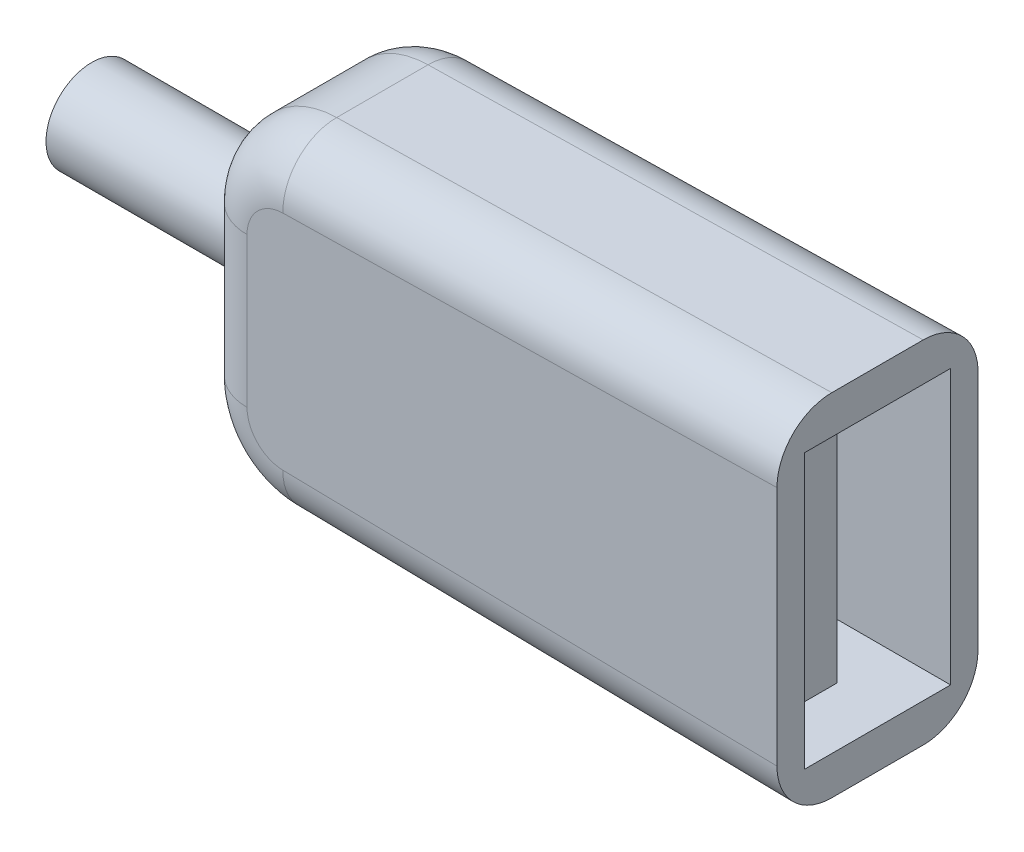
ISO-10303-21;
HEADER;
FILE_DESCRIPTION(('STEP AP214'),'2;1');
FILE_NAME('part.step','',(''),(''),'','','');
FILE_SCHEMA(('AUTOMOTIVE_DESIGN { 1 0 10303 214 1 1 1 1 }'));
ENDSEC;
DATA;
#1=APPLICATION_CONTEXT('core data for automotive mechanical design processes');
#2=APPLICATION_PROTOCOL_DEFINITION('international standard','automotive_design',2000,#1);
#3=PRODUCT_CONTEXT('',#1,'mechanical');
#4=PRODUCT('Part','Part','',(#3));
#5=PRODUCT_RELATED_PRODUCT_CATEGORY('part','',(#4));
#6=PRODUCT_DEFINITION_FORMATION('','',#4);
#7=PRODUCT_DEFINITION_CONTEXT('part definition',#1,'design');
#8=PRODUCT_DEFINITION('design','',#6,#7);
#9=PRODUCT_DEFINITION_SHAPE('','',#8);
#10=(LENGTH_UNIT() NAMED_UNIT(*) SI_UNIT(.MILLI.,.METRE.));
#11=(NAMED_UNIT(*) PLANE_ANGLE_UNIT() SI_UNIT($,.RADIAN.));
#12=(NAMED_UNIT(*) SI_UNIT($,.STERADIAN.) SOLID_ANGLE_UNIT());
#13=UNCERTAINTY_MEASURE_WITH_UNIT(LENGTH_MEASURE(1.E-05),#10,'distance_accuracy_value','');
#14=(GEOMETRIC_REPRESENTATION_CONTEXT(3) GLOBAL_UNCERTAINTY_ASSIGNED_CONTEXT((#13)) GLOBAL_UNIT_ASSIGNED_CONTEXT((#10,
#11,#12)) REPRESENTATION_CONTEXT('',''));
#15=CARTESIAN_POINT('',(0.,0.,0.));
#16=DIRECTION('',(0.,0.,1.));
#17=DIRECTION('',(1.,0.,0.));
#18=AXIS2_PLACEMENT_3D('',#15,#16,#17);
#19=CARTESIAN_POINT('',(-15.,0.,0.));
#20=DIRECTION('',(-1.,0.,0.));
#21=DIRECTION('',(0.,0.,1.));
#22=AXIS2_PLACEMENT_3D('',#19,#20,#21);
#23=PLANE('',#22);
#24=DIRECTION('',(0.,1.,0.));
#25=VECTOR('',#24,1.);
#26=CARTESIAN_POINT('',(-15.,-7.50000000000002,1.5));
#27=LINE('',#26,#25);
#28=CARTESIAN_POINT('',(-15.,-7.50000000000002,1.5));
#29=VERTEX_POINT('',#28);
#30=CARTESIAN_POINT('',(-15.,7.49999999999998,1.5));
#31=VERTEX_POINT('',#30);
#32=EDGE_CURVE('E224',#29,#31,#27,.T.);
#33=ORIENTED_EDGE('',*,*,#32,.T.);
#34=DIRECTION('',(0.,0.,1.));
#35=VECTOR('',#34,1.);
#36=CARTESIAN_POINT('',(-15.,7.49999999999998,9.5));
#37=LINE('',#36,#35);
#38=CARTESIAN_POINT('',(-15.,7.49999999999998,9.5));
#39=VERTEX_POINT('',#38);
#40=EDGE_CURVE('E228',#31,#39,#37,.T.);
#41=ORIENTED_EDGE('',*,*,#40,.T.);
#42=DIRECTION('',(0.,-1.,0.));
#43=VECTOR('',#42,1.);
#44=CARTESIAN_POINT('',(-15.,-7.50000000000002,9.5));
#45=LINE('',#44,#43);
#46=CARTESIAN_POINT('',(-15.,-7.50000000000002,9.5));
#47=VERTEX_POINT('',#46);
#48=EDGE_CURVE('E233',#39,#47,#45,.T.);
#49=ORIENTED_EDGE('',*,*,#48,.T.);
#50=DIRECTION('',(0.,0.,-1.));
#51=VECTOR('',#50,1.);
#52=CARTESIAN_POINT('',(-15.,-7.50000000000002,9.5));
#53=LINE('',#52,#51);
#54=EDGE_CURVE('E237',#47,#29,#53,.T.);
#55=ORIENTED_EDGE('',*,*,#54,.T.);
#56=EDGE_LOOP('',(#33,#41,#49,#55));
#57=FACE_BOUND('',#56,.T.);
#58=DIRECTION('',(0.,-1.,0.));
#59=VECTOR('',#58,1.);
#60=CARTESIAN_POINT('',(-15.,6.29588436034375,7.56199322167627));
#61=LINE('',#60,#59);
#62=CARTESIAN_POINT('',(-15.,6.29588436034375,7.56199322167627));
#63=VERTEX_POINT('',#62);
#64=CARTESIAN_POINT('',(-15.,-6.30058420519995,7.56199322167627));
#65=VERTEX_POINT('',#64);
#66=EDGE_CURVE('E212',#63,#65,#61,.T.);
#67=ORIENTED_EDGE('',*,*,#66,.F.);
#68=DIRECTION('',(0.,0.,1.));
#69=VECTOR('',#68,1.);
#70=CARTESIAN_POINT('',(-15.,6.29588436034375,7.56199322167627));
#71=LINE('',#70,#69);
#72=CARTESIAN_POINT('',(-15.,6.29588436034375,5.70444947007536));
#73=VERTEX_POINT('',#72);
#74=EDGE_CURVE('E209',#73,#63,#71,.T.);
#75=ORIENTED_EDGE('',*,*,#74,.F.);
#76=DIRECTION('',(0.,1.,0.));
#77=VECTOR('',#76,1.);
#78=CARTESIAN_POINT('',(-15.,6.29588436034375,5.70444947007536));
#79=LINE('',#78,#77);
#80=CARTESIAN_POINT('',(-15.,-6.30058420519995,5.70444947007536));
#81=VERTEX_POINT('',#80);
#82=EDGE_CURVE('E68',#81,#73,#79,.T.);
#83=ORIENTED_EDGE('',*,*,#82,.F.);
#84=DIRECTION('',(0.,0.,-1.));
#85=VECTOR('',#84,1.);
#86=CARTESIAN_POINT('',(-15.,-6.30058420519995,7.56199322167627));
#87=LINE('',#86,#85);
#88=EDGE_CURVE('E63',#65,#81,#87,.T.);
#89=ORIENTED_EDGE('',*,*,#88,.F.);
#90=EDGE_LOOP('',(#67,#75,#83,#89));
#91=FACE_BOUND('',#90,.T.);
#92=ADVANCED_FACE('F45',(#57,#91),#23,.F.);
#93=CARTESIAN_POINT('',(-32.,-9.00000000000001,11.));
#94=DIRECTION('',(1.,0.,0.));
#95=DIRECTION('',(0.,0.,-1.));
#96=AXIS2_PLACEMENT_3D('',#93,#94,#95);
#97=PLANE('',#96);
#98=CARTESIAN_POINT('',(-32.,0.,5.5));
#99=DIRECTION('',(-1.,0.,0.));
#100=DIRECTION('',(0.,0.,1.));
#101=AXIS2_PLACEMENT_3D('',#98,#99,#100);
#102=CIRCLE('',#101,2.5);
#103=CARTESIAN_POINT('',(-32.,0.,3.));
#104=VERTEX_POINT('',#103);
#105=CARTESIAN_POINT('',(-32.,0.,8.));
#106=VERTEX_POINT('',#105);
#107=EDGE_CURVE('E255',#104,#106,#102,.T.);
#108=ORIENTED_EDGE('',*,*,#107,.F.);
#109=DIRECTION('',(0.,-1.,0.));
#110=VECTOR('',#109,1.);
#111=CARTESIAN_POINT('',(-32.,-4.09287117098406,3.));
#112=LINE('',#111,#110);
#113=CARTESIAN_POINT('',(-32.,-4.09287117098406,3.));
#114=VERTEX_POINT('',#113);
#115=EDGE_CURVE('E352',#104,#114,#112,.T.);
#116=ORIENTED_EDGE('',*,*,#115,.T.);
#117=DIRECTION('',(0.,0.,-1.));
#118=VECTOR('',#117,1.);
#119=CARTESIAN_POINT('',(-32.,-4.09287117098406,11.));
#120=LINE('',#119,#118);
#121=CARTESIAN_POINT('',(-32.,-4.09287117098406,8.));
#122=VERTEX_POINT('',#121);
#123=EDGE_CURVE('E299',#114,#122,#120,.F.);
#124=ORIENTED_EDGE('',*,*,#123,.T.);
#125=DIRECTION('',(0.,-1.,0.));
#126=VECTOR('',#125,1.);
#127=CARTESIAN_POINT('',(-32.,-9.00000000000001,8.));
#128=LINE('',#127,#126);
#129=EDGE_CURVE('E348',#122,#106,#128,.F.);
#130=ORIENTED_EDGE('',*,*,#129,.T.);
#131=EDGE_LOOP('',(#108,#116,#124,#130));
#132=FACE_BOUND('',#131,.T.);
#133=ADVANCED_FACE('F464',(#132),#97,.F.);
#134=CARTESIAN_POINT('',(0.,-9.60000000000002,11.));
#135=DIRECTION('',(0.0187467049703441,0.999824265084997,0.));
#136=DIRECTION('',(-0.999824265084997,0.0187467049703441,0.));
#137=AXIS2_PLACEMENT_3D('',#134,#135,#136);
#138=PLANE('',#137);
#139=DIRECTION('',(0.,0.,-1.));
#140=VECTOR('',#139,1.);
#141=CARTESIAN_POINT('',(-27.0937335248517,-9.09199249640904,11.));
#142=LINE('',#141,#140);
#143=CARTESIAN_POINT('',(-27.0937335248517,-9.09199249640904,8.));
#144=VERTEX_POINT('',#143);
#145=CARTESIAN_POINT('',(-27.0937335248517,-9.09199249640904,3.));
#146=VERTEX_POINT('',#145);
#147=EDGE_CURVE('E291',#144,#146,#142,.T.);
#148=ORIENTED_EDGE('',*,*,#147,.T.);
#149=DIRECTION('',(0.999824265084997,-0.0187467049703441,0.));
#150=VECTOR('',#149,1.);
#151=CARTESIAN_POINT('',(0.,-9.60000000000002,3.));
#152=LINE('',#151,#150);
#153=CARTESIAN_POINT('',(0.,-9.60000000000002,3.));
#154=VERTEX_POINT('',#153);
#155=EDGE_CURVE('E310',#146,#154,#152,.T.);
#156=ORIENTED_EDGE('',*,*,#155,.T.);
#157=DIRECTION('',(0.,0.,-1.));
#158=VECTOR('',#157,1.);
#159=CARTESIAN_POINT('',(0.,-9.60000000000002,11.));
#160=LINE('',#159,#158);
#161=CARTESIAN_POINT('',(0.,-9.60000000000002,8.));
#162=VERTEX_POINT('',#161);
#163=EDGE_CURVE('E287',#162,#154,#160,.T.);
#164=ORIENTED_EDGE('',*,*,#163,.F.);
#165=DIRECTION('',(0.999824265084997,-0.0187467049703441,0.));
#166=VECTOR('',#165,1.);
#167=CARTESIAN_POINT('',(0.,-9.60000000000002,8.));
#168=LINE('',#167,#166);
#169=EDGE_CURVE('E307',#162,#144,#168,.F.);
#170=ORIENTED_EDGE('',*,*,#169,.T.);
#171=EDGE_LOOP('',(#148,#156,#164,#170));
#172=FACE_BOUND('',#171,.T.);
#173=ADVANCED_FACE('F483',(#172),#138,.F.);
#174=CARTESIAN_POINT('',(0.,9.59999999999997,11.));
#175=DIRECTION('',(-1.,0.,0.));
#176=DIRECTION('',(0.,0.,1.));
#177=AXIS2_PLACEMENT_3D('',#174,#175,#176);
#178=PLANE('',#177);
#179=DIRECTION('',(0.,0.,1.));
#180=VECTOR('',#179,1.);
#181=CARTESIAN_POINT('',(0.,7.49999999999998,9.5));
#182=LINE('',#181,#180);
#183=CARTESIAN_POINT('',(0.,7.49999999999998,1.5));
#184=VERTEX_POINT('',#183);
#185=CARTESIAN_POINT('',(0.,7.49999999999998,9.5));
#186=VERTEX_POINT('',#185);
#187=EDGE_CURVE('E218',#184,#186,#182,.T.);
#188=ORIENTED_EDGE('',*,*,#187,.F.);
#189=DIRECTION('',(0.,1.,0.));
#190=VECTOR('',#189,1.);
#191=CARTESIAN_POINT('',(0.,-7.50000000000002,1.5));
#192=LINE('',#191,#190);
#193=CARTESIAN_POINT('',(0.,-7.50000000000002,1.5));
#194=VERTEX_POINT('',#193);
#195=EDGE_CURVE('E214',#194,#184,#192,.T.);
#196=ORIENTED_EDGE('',*,*,#195,.F.);
#197=DIRECTION('',(0.,0.,-1.));
#198=VECTOR('',#197,1.);
#199=CARTESIAN_POINT('',(0.,-7.50000000000002,9.5));
#200=LINE('',#199,#198);
#201=CARTESIAN_POINT('',(0.,-7.50000000000002,9.5));
#202=VERTEX_POINT('',#201);
#203=EDGE_CURVE('E229',#202,#194,#200,.T.);
#204=ORIENTED_EDGE('',*,*,#203,.F.);
#205=DIRECTION('',(0.,-1.,0.));
#206=VECTOR('',#205,1.);
#207=CARTESIAN_POINT('',(0.,-7.50000000000002,9.5));
#208=LINE('',#207,#206);
#209=EDGE_CURVE('E245',#186,#202,#208,.T.);
#210=ORIENTED_EDGE('',*,*,#209,.F.);
#211=EDGE_LOOP('',(#188,#196,#204,#210));
#212=FACE_BOUND('',#211,.T.);
#213=ORIENTED_EDGE('',*,*,#163,.T.);
#214=CARTESIAN_POINT('',(0.,-6.59947270259045,3.));
#215=DIRECTION('',(-1.,0.,0.));
#216=DIRECTION('',(0.,1.,0.));
#217=AXIS2_PLACEMENT_3D('',#214,#215,#216);
#218=ELLIPSE('',#217,3.00052729740957,3.);
#219=CARTESIAN_POINT('',(0.,-6.59947270259045,0.));
#220=VERTEX_POINT('',#219);
#221=EDGE_CURVE('E323',#154,#220,#218,.F.);
#222=ORIENTED_EDGE('',*,*,#221,.T.);
#223=DIRECTION('',(0.,1.,0.));
#224=VECTOR('',#223,1.);
#225=CARTESIAN_POINT('',(0.,9.59999999999997,0.));
#226=LINE('',#225,#224);
#227=CARTESIAN_POINT('',(0.,6.5994727025904,0.));
#228=VERTEX_POINT('',#227);
#229=EDGE_CURVE('E279',#220,#228,#226,.T.);
#230=ORIENTED_EDGE('',*,*,#229,.T.);
#231=CARTESIAN_POINT('',(0.,6.5994727025904,3.));
#232=DIRECTION('',(-1.,0.,0.));
#233=DIRECTION('',(0.,1.,0.));
#234=AXIS2_PLACEMENT_3D('',#231,#232,#233);
#235=ELLIPSE('',#234,3.00052729740957,3.);
#236=CARTESIAN_POINT('',(0.,9.59999999999997,3.));
#237=VERTEX_POINT('',#236);
#238=EDGE_CURVE('E317',#228,#237,#235,.F.);
#239=ORIENTED_EDGE('',*,*,#238,.T.);
#240=DIRECTION('',(0.,0.,-1.));
#241=VECTOR('',#240,1.);
#242=CARTESIAN_POINT('',(0.,9.59999999999997,11.));
#243=LINE('',#242,#241);
#244=CARTESIAN_POINT('',(0.,9.59999999999997,8.));
#245=VERTEX_POINT('',#244);
#246=EDGE_CURVE('E278',#245,#237,#243,.T.);
#247=ORIENTED_EDGE('',*,*,#246,.F.);
#248=CARTESIAN_POINT('',(0.,6.5994727025904,8.));
#249=DIRECTION('',(-1.,0.,0.));
#250=DIRECTION('',(0.,-1.,0.));
#251=AXIS2_PLACEMENT_3D('',#248,#249,#250);
#252=ELLIPSE('',#251,3.00052729740957,3.);
#253=CARTESIAN_POINT('',(0.,6.5994727025904,11.));
#254=VERTEX_POINT('',#253);
#255=EDGE_CURVE('E320',#245,#254,#252,.F.);
#256=ORIENTED_EDGE('',*,*,#255,.T.);
#257=DIRECTION('',(0.,1.,0.));
#258=VECTOR('',#257,1.);
#259=CARTESIAN_POINT('',(0.,9.59999999999997,11.));
#260=LINE('',#259,#258);
#261=CARTESIAN_POINT('',(0.,-6.59947270259045,11.));
#262=VERTEX_POINT('',#261);
#263=EDGE_CURVE('E274',#262,#254,#260,.T.);
#264=ORIENTED_EDGE('',*,*,#263,.F.);
#265=CARTESIAN_POINT('',(0.,-6.59947270259045,8.));
#266=DIRECTION('',(-1.,0.,0.));
#267=DIRECTION('',(0.,-1.,0.));
#268=AXIS2_PLACEMENT_3D('',#265,#266,#267);
#269=ELLIPSE('',#268,3.00052729740957,3.);
#270=EDGE_CURVE('E314',#262,#162,#269,.F.);
#271=ORIENTED_EDGE('',*,*,#270,.T.);
#272=EDGE_LOOP('',(#213,#222,#230,#239,#247,#256,#264,#271));
#273=FACE_BOUND('',#272,.T.);
#274=ADVANCED_FACE('F423',(#212,#273),#178,.F.);
#275=CARTESIAN_POINT('',(-32.,8.99999999999999,11.));
#276=DIRECTION('',(0.0187467049703433,-0.999824265084997,0.));
#277=DIRECTION('',(0.999824265084997,0.0187467049703433,0.));
#278=AXIS2_PLACEMENT_3D('',#275,#276,#277);
#279=PLANE('',#278);
#280=DIRECTION('',(0.,0.,-1.));
#281=VECTOR('',#280,1.);
#282=CARTESIAN_POINT('',(-27.0937335248517,9.09199249640902,11.));
#283=LINE('',#282,#281);
#284=CARTESIAN_POINT('',(-27.0937335248517,9.09199249640902,3.));
#285=VERTEX_POINT('',#284);
#286=CARTESIAN_POINT('',(-27.0937335248517,9.09199249640902,8.));
#287=VERTEX_POINT('',#286);
#288=EDGE_CURVE('E303',#285,#287,#283,.F.);
#289=ORIENTED_EDGE('',*,*,#288,.T.);
#290=DIRECTION('',(-0.999824265084997,-0.0187467049703433,0.));
#291=VECTOR('',#290,1.);
#292=CARTESIAN_POINT('',(-32.,8.99999999999999,8.));
#293=LINE('',#292,#291);
#294=EDGE_CURVE('E11',#287,#245,#293,.F.);
#295=ORIENTED_EDGE('',*,*,#294,.T.);
#296=ORIENTED_EDGE('',*,*,#246,.T.);
#297=DIRECTION('',(-0.999824265084997,-0.0187467049703433,0.));
#298=VECTOR('',#297,1.);
#299=CARTESIAN_POINT('',(-27.0937335248517,9.09199249640902,3.));
#300=LINE('',#299,#298);
#301=EDGE_CURVE('E55',#237,#285,#300,.T.);
#302=ORIENTED_EDGE('',*,*,#301,.T.);
#303=EDGE_LOOP('',(#289,#295,#296,#302));
#304=FACE_BOUND('',#303,.T.);
#305=ADVANCED_FACE('F444',(#304),#279,.F.);
#306=EDGE_CURVE('E270',#106,#104,#102,.T.);
#307=ORIENTED_EDGE('',*,*,#306,.F.);
#308=CARTESIAN_POINT('',(-32.,4.09287117098403,8.));
#309=VERTEX_POINT('',#308);
#310=EDGE_CURVE('E347',#106,#309,#128,.F.);
#311=ORIENTED_EDGE('',*,*,#310,.T.);
#312=DIRECTION('',(0.,0.,-1.));
#313=VECTOR('',#312,1.);
#314=CARTESIAN_POINT('',(-32.,4.09287117098403,11.));
#315=LINE('',#314,#313);
#316=CARTESIAN_POINT('',(-32.,4.09287117098403,3.));
#317=VERTEX_POINT('',#316);
#318=EDGE_CURVE('E295',#309,#317,#315,.T.);
#319=ORIENTED_EDGE('',*,*,#318,.T.);
#320=EDGE_CURVE('E353',#317,#104,#112,.T.);
#321=ORIENTED_EDGE('',*,*,#320,.T.);
#322=EDGE_LOOP('',(#307,#311,#319,#321));
#323=FACE_BOUND('',#322,.T.);
#324=ADVANCED_FACE('F457',(#323),#97,.F.);
#325=CARTESIAN_POINT('',(0.,0.,11.));
#326=DIRECTION('',(0.,0.,-1.));
#327=DIRECTION('',(-1.,0.,0.));
#328=AXIS2_PLACEMENT_3D('',#325,#326,#327);
#329=PLANE('',#328);
#330=ORIENTED_EDGE('',*,*,#263,.T.);
#331=DIRECTION('',(-0.999824265084997,-0.0187467049703433,0.));
#332=VECTOR('',#331,1.);
#333=CARTESIAN_POINT('',(-0.123696626078461,6.59715339085143,11.));
#334=LINE('',#333,#332);
#335=CARTESIAN_POINT('',(-27.0374934099407,6.09251970115402,11.));
#336=VERTEX_POINT('',#335);
#337=EDGE_CURVE('E374',#254,#336,#334,.T.);
#338=ORIENTED_EDGE('',*,*,#337,.T.);
#339=CARTESIAN_POINT('',(-27.,4.09287117098403,11.));
#340=DIRECTION('',(0.,0.,-1.));
#341=DIRECTION('',(-1.,0.,0.));
#342=AXIS2_PLACEMENT_3D('',#339,#340,#341);
#343=CIRCLE('',#342,2.);
#344=CARTESIAN_POINT('',(-29.,4.09287117098403,11.));
#345=VERTEX_POINT('',#344);
#346=EDGE_CURVE('E371',#336,#345,#343,.F.);
#347=ORIENTED_EDGE('',*,*,#346,.T.);
#348=DIRECTION('',(0.,-1.,0.));
#349=VECTOR('',#348,1.);
#350=CARTESIAN_POINT('',(-29.,0.,11.));
#351=LINE('',#350,#349);
#352=CARTESIAN_POINT('',(-29.,-4.09287117098406,11.));
#353=VERTEX_POINT('',#352);
#354=EDGE_CURVE('E368',#345,#353,#351,.T.);
#355=ORIENTED_EDGE('',*,*,#354,.T.);
#356=CARTESIAN_POINT('',(-27.,-4.09287117098406,11.));
#357=DIRECTION('',(0.,0.,-1.));
#358=DIRECTION('',(-1.,0.,0.));
#359=AXIS2_PLACEMENT_3D('',#356,#357,#358);
#360=CIRCLE('',#359,2.);
#361=CARTESIAN_POINT('',(-27.0374934099407,-6.09251970115405,11.));
#362=VERTEX_POINT('',#361);
#363=EDGE_CURVE('E365',#353,#362,#360,.F.);
#364=ORIENTED_EDGE('',*,*,#363,.T.);
#365=DIRECTION('',(0.999824265084997,-0.0187467049703441,0.));
#366=VECTOR('',#365,1.);
#367=CARTESIAN_POINT('',(-0.123696626078468,-6.59715339085148,11.));
#368=LINE('',#367,#366);
#369=EDGE_CURVE('E362',#362,#262,#368,.T.);
#370=ORIENTED_EDGE('',*,*,#369,.T.);
#371=EDGE_LOOP('',(#330,#338,#347,#355,#364,#370));
#372=FACE_BOUND('',#371,.T.);
#373=ADVANCED_FACE('F420',(#372),#329,.F.);
#374=CARTESIAN_POINT('',(0.,0.,0.));
#375=DIRECTION('',(0.,0.,-1.));
#376=DIRECTION('',(-1.,0.,0.));
#377=AXIS2_PLACEMENT_3D('',#374,#375,#376);
#378=PLANE('',#377);
#379=ORIENTED_EDGE('',*,*,#229,.F.);
#380=DIRECTION('',(0.999824265084997,-0.0187467049703441,0.));
#381=VECTOR('',#380,1.);
#382=CARTESIAN_POINT('',(-27.0374934099407,-6.09251970115405,0.));
#383=LINE('',#382,#381);
#384=CARTESIAN_POINT('',(-27.0374934099407,-6.09251970115405,0.));
#385=VERTEX_POINT('',#384);
#386=EDGE_CURVE('E338',#220,#385,#383,.F.);
#387=ORIENTED_EDGE('',*,*,#386,.T.);
#388=CARTESIAN_POINT('',(-27.,-4.09287117098406,0.));
#389=DIRECTION('',(0.,0.,-1.));
#390=DIRECTION('',(-1.,0.,0.));
#391=AXIS2_PLACEMENT_3D('',#388,#389,#390);
#392=CIRCLE('',#391,2.);
#393=CARTESIAN_POINT('',(-29.,-4.09287117098406,0.));
#394=VERTEX_POINT('',#393);
#395=EDGE_CURVE('E335',#385,#394,#392,.T.);
#396=ORIENTED_EDGE('',*,*,#395,.T.);
#397=DIRECTION('',(0.,-1.,0.));
#398=VECTOR('',#397,1.);
#399=CARTESIAN_POINT('',(-29.,4.09287117098403,0.));
#400=LINE('',#399,#398);
#401=CARTESIAN_POINT('',(-29.,4.09287117098403,0.));
#402=VERTEX_POINT('',#401);
#403=EDGE_CURVE('E332',#394,#402,#400,.F.);
#404=ORIENTED_EDGE('',*,*,#403,.T.);
#405=CARTESIAN_POINT('',(-27.,4.09287117098403,0.));
#406=DIRECTION('',(0.,0.,-1.));
#407=DIRECTION('',(-1.,0.,0.));
#408=AXIS2_PLACEMENT_3D('',#405,#406,#407);
#409=CIRCLE('',#408,2.);
#410=CARTESIAN_POINT('',(-27.0374934099407,6.09251970115403,0.));
#411=VERTEX_POINT('',#410);
#412=EDGE_CURVE('E329',#402,#411,#409,.T.);
#413=ORIENTED_EDGE('',*,*,#412,.T.);
#414=DIRECTION('',(-0.999824265084997,-0.0187467049703433,0.));
#415=VECTOR('',#414,1.);
#416=CARTESIAN_POINT('',(0.0562401149110311,6.60052720474498,0.));
#417=LINE('',#416,#415);
#418=EDGE_CURVE('E326',#411,#228,#417,.F.);
#419=ORIENTED_EDGE('',*,*,#418,.T.);
#420=EDGE_LOOP('',(#379,#387,#396,#404,#413,#419));
#421=FACE_BOUND('',#420,.T.);
#422=ADVANCED_FACE('F486',(#421),#378,.T.);
#423=CARTESIAN_POINT('',(-27.,-4.09287117098406,11.));
#424=DIRECTION('',(0.,0.,-1.));
#425=DIRECTION('',(-1.,0.,0.));
#426=AXIS2_PLACEMENT_3D('',#423,#424,#425);
#427=CYLINDRICAL_SURFACE('',#426,5.);
#428=ORIENTED_EDGE('',*,*,#123,.F.);
#429=CARTESIAN_POINT('',(-27.,-4.09287117098406,3.));
#430=DIRECTION('',(0.,0.,-1.));
#431=DIRECTION('',(-1.,0.,0.));
#432=AXIS2_PLACEMENT_3D('',#429,#430,#431);
#433=CIRCLE('',#432,5.);
#434=EDGE_CURVE('E344',#114,#146,#433,.F.);
#435=ORIENTED_EDGE('',*,*,#434,.T.);
#436=ORIENTED_EDGE('',*,*,#147,.F.);
#437=CARTESIAN_POINT('',(-27.,-4.09287117098406,8.));
#438=DIRECTION('',(0.,0.,-1.));
#439=DIRECTION('',(-1.,0.,0.));
#440=AXIS2_PLACEMENT_3D('',#437,#438,#439);
#441=CIRCLE('',#440,5.);
#442=EDGE_CURVE('E341',#144,#122,#441,.T.);
#443=ORIENTED_EDGE('',*,*,#442,.T.);
#444=EDGE_LOOP('',(#428,#435,#436,#443));
#445=FACE_BOUND('',#444,.T.);
#446=ADVANCED_FACE('F469',(#445),#427,.T.);
#447=CARTESIAN_POINT('',(-27.,4.09287117098403,11.));
#448=DIRECTION('',(0.,0.,-1.));
#449=DIRECTION('',(-1.,0.,0.));
#450=AXIS2_PLACEMENT_3D('',#447,#448,#449);
#451=CYLINDRICAL_SURFACE('',#450,5.);
#452=ORIENTED_EDGE('',*,*,#288,.F.);
#453=CARTESIAN_POINT('',(-27.,4.09287117098403,3.));
#454=DIRECTION('',(0.,0.,-1.));
#455=DIRECTION('',(-1.,0.,0.));
#456=AXIS2_PLACEMENT_3D('',#453,#454,#455);
#457=CIRCLE('',#456,5.);
#458=EDGE_CURVE('E359',#285,#317,#457,.F.);
#459=ORIENTED_EDGE('',*,*,#458,.T.);
#460=ORIENTED_EDGE('',*,*,#318,.F.);
#461=CARTESIAN_POINT('',(-27.,4.09287117098403,8.));
#462=DIRECTION('',(0.,0.,-1.));
#463=DIRECTION('',(-1.,0.,0.));
#464=AXIS2_PLACEMENT_3D('',#461,#462,#463);
#465=CIRCLE('',#464,5.);
#466=EDGE_CURVE('E356',#309,#287,#465,.T.);
#467=ORIENTED_EDGE('',*,*,#466,.T.);
#468=EDGE_LOOP('',(#452,#459,#460,#467));
#469=FACE_BOUND('',#468,.T.);
#470=ADVANCED_FACE('F441',(#469),#451,.T.);
#471=CARTESIAN_POINT('',(-31.943759885089,6.000527204745,3.));
#472=DIRECTION('',(0.999824265084997,0.0187467049703433,0.));
#473=DIRECTION('',(-0.0187467049703433,0.999824265084997,0.));
#474=AXIS2_PLACEMENT_3D('',#471,#472,#473);
#475=CYLINDRICAL_SURFACE('',#474,3.);
#476=ORIENTED_EDGE('',*,*,#238,.F.);
#477=ORIENTED_EDGE('',*,*,#418,.F.);
#478=CARTESIAN_POINT('',(-27.0374934099407,6.09251970115402,3.));
#479=DIRECTION('',(-0.999824265084997,-0.0187467049703437,0.));
#480=DIRECTION('',(0.0187467049703437,-0.999824265084997,0.));
#481=AXIS2_PLACEMENT_3D('',#478,#479,#480);
#482=CIRCLE('',#481,3.);
#483=EDGE_CURVE('E283',#285,#411,#482,.T.);
#484=ORIENTED_EDGE('',*,*,#483,.F.);
#485=ORIENTED_EDGE('',*,*,#301,.F.);
#486=EDGE_LOOP('',(#476,#477,#484,#485));
#487=FACE_BOUND('',#486,.T.);
#488=ADVANCED_FACE('F448',(#487),#475,.T.);
#489=CARTESIAN_POINT('',(-27.,4.09287117098403,3.));
#490=DIRECTION('',(0.,0.,-1.));
#491=DIRECTION('',(-1.,0.,0.));
#492=AXIS2_PLACEMENT_3D('',#489,#490,#491);
#493=DEGENERATE_TOROIDAL_SURFACE('',#492,2.,3.,.T.);
#494=ORIENTED_EDGE('',*,*,#483,.T.);
#495=ORIENTED_EDGE('',*,*,#412,.F.);
#496=CARTESIAN_POINT('',(-29.,4.09287117098403,3.));
#497=DIRECTION('',(0.,-1.,0.));
#498=DIRECTION('',(0.,0.,-1.));
#499=AXIS2_PLACEMENT_3D('',#496,#497,#498);
#500=CIRCLE('',#499,3.);
#501=EDGE_CURVE('E388',#317,#402,#500,.T.);
#502=ORIENTED_EDGE('',*,*,#501,.F.);
#503=ORIENTED_EDGE('',*,*,#458,.F.);
#504=EDGE_LOOP('',(#494,#495,#502,#503));
#505=FACE_BOUND('',#504,.T.);
#506=ADVANCED_FACE('F454',(#505),#493,.T.);
#507=CARTESIAN_POINT('',(-29.,-9.00000000000001,3.));
#508=DIRECTION('',(0.,1.,0.));
#509=DIRECTION('',(0.,0.,1.));
#510=AXIS2_PLACEMENT_3D('',#507,#508,#509);
#511=CYLINDRICAL_SURFACE('',#510,3.);
#512=ORIENTED_EDGE('',*,*,#501,.T.);
#513=ORIENTED_EDGE('',*,*,#403,.F.);
#514=CARTESIAN_POINT('',(-29.,-4.09287117098406,3.));
#515=DIRECTION('',(0.,-1.,0.));
#516=DIRECTION('',(0.,0.,-1.));
#517=AXIS2_PLACEMENT_3D('',#514,#515,#516);
#518=CIRCLE('',#517,3.);
#519=EDGE_CURVE('E384',#114,#394,#518,.T.);
#520=ORIENTED_EDGE('',*,*,#519,.F.);
#521=ORIENTED_EDGE('',*,*,#115,.F.);
#522=ORIENTED_EDGE('',*,*,#320,.F.);
#523=EDGE_LOOP('',(#512,#513,#520,#521,#522));
#524=FACE_BOUND('',#523,.T.);
#525=ADVANCED_FACE('F473',(#524),#511,.T.);
#526=CARTESIAN_POINT('',(-27.,-4.09287117098406,3.));
#527=DIRECTION('',(0.,0.,-1.));
#528=DIRECTION('',(-1.,0.,0.));
#529=AXIS2_PLACEMENT_3D('',#526,#527,#528);
#530=DEGENERATE_TOROIDAL_SURFACE('',#529,2.,3.,.T.);
#531=ORIENTED_EDGE('',*,*,#519,.T.);
#532=ORIENTED_EDGE('',*,*,#395,.F.);
#533=CARTESIAN_POINT('',(-27.0374934099407,-6.09251970115405,3.));
#534=DIRECTION('',(0.999824265084997,-0.0187467049703437,0.));
#535=DIRECTION('',(0.0187467049703437,0.999824265084997,0.));
#536=AXIS2_PLACEMENT_3D('',#533,#534,#535);
#537=CIRCLE('',#536,3.);
#538=EDGE_CURVE('E380',#146,#385,#537,.T.);
#539=ORIENTED_EDGE('',*,*,#538,.F.);
#540=ORIENTED_EDGE('',*,*,#434,.F.);
#541=EDGE_LOOP('',(#531,#532,#539,#540));
#542=FACE_BOUND('',#541,.T.);
#543=ADVANCED_FACE('F477',(#542),#530,.T.);
#544=CARTESIAN_POINT('',(0.0562401149110324,-6.60052720474503,3.));
#545=DIRECTION('',(-0.999824265084997,0.0187467049703441,0.));
#546=DIRECTION('',(-0.0187467049703441,-0.999824265084997,0.));
#547=AXIS2_PLACEMENT_3D('',#544,#545,#546);
#548=CYLINDRICAL_SURFACE('',#547,3.);
#549=ORIENTED_EDGE('',*,*,#538,.T.);
#550=ORIENTED_EDGE('',*,*,#386,.F.);
#551=ORIENTED_EDGE('',*,*,#221,.F.);
#552=ORIENTED_EDGE('',*,*,#155,.F.);
#553=EDGE_LOOP('',(#549,#550,#551,#552));
#554=FACE_BOUND('',#553,.T.);
#555=ADVANCED_FACE('F481',(#554),#548,.T.);
#556=CARTESIAN_POINT('',(-0.123696626078468,-6.59715339085148,8.));
#557=DIRECTION('',(0.999824265084997,-0.0187467049703441,0.));
#558=DIRECTION('',(0.0187467049703441,0.999824265084997,0.));
#559=AXIS2_PLACEMENT_3D('',#556,#557,#558);
#560=CYLINDRICAL_SURFACE('',#559,3.);
#561=ORIENTED_EDGE('',*,*,#270,.F.);
#562=ORIENTED_EDGE('',*,*,#369,.F.);
#563=CARTESIAN_POINT('',(-27.0374934099407,-6.09251970115405,8.));
#564=DIRECTION('',(-0.999824265084997,0.0187467049703437,0.));
#565=DIRECTION('',(-0.0187467049703437,-0.999824265084997,0.));
#566=AXIS2_PLACEMENT_3D('',#563,#564,#565);
#567=CIRCLE('',#566,3.);
#568=EDGE_CURVE('E49',#144,#362,#567,.T.);
#569=ORIENTED_EDGE('',*,*,#568,.F.);
#570=ORIENTED_EDGE('',*,*,#169,.F.);
#571=EDGE_LOOP('',(#561,#562,#569,#570));
#572=FACE_BOUND('',#571,.T.);
#573=ADVANCED_FACE('F47',(#572),#560,.T.);
#574=CARTESIAN_POINT('',(-27.,-4.09287117098406,8.));
#575=DIRECTION('',(0.,0.,-1.));
#576=DIRECTION('',(-1.,0.,0.));
#577=AXIS2_PLACEMENT_3D('',#574,#575,#576);
#578=DEGENERATE_TOROIDAL_SURFACE('',#577,2.,3.,.T.);
#579=ORIENTED_EDGE('',*,*,#568,.T.);
#580=ORIENTED_EDGE('',*,*,#363,.F.);
#581=CARTESIAN_POINT('',(-29.,-4.09287117098406,8.));
#582=DIRECTION('',(0.,1.,0.));
#583=DIRECTION('',(0.,0.,1.));
#584=AXIS2_PLACEMENT_3D('',#581,#582,#583);
#585=CIRCLE('',#584,3.);
#586=EDGE_CURVE('E400',#122,#353,#585,.T.);
#587=ORIENTED_EDGE('',*,*,#586,.F.);
#588=ORIENTED_EDGE('',*,*,#442,.F.);
#589=EDGE_LOOP('',(#579,#580,#587,#588));
#590=FACE_BOUND('',#589,.T.);
#591=ADVANCED_FACE('F413',(#590),#578,.T.);
#592=CARTESIAN_POINT('',(-29.,0.,8.));
#593=DIRECTION('',(0.,-1.,0.));
#594=DIRECTION('',(0.,0.,-1.));
#595=AXIS2_PLACEMENT_3D('',#592,#593,#594);
#596=CYLINDRICAL_SURFACE('',#595,3.);
#597=ORIENTED_EDGE('',*,*,#586,.T.);
#598=ORIENTED_EDGE('',*,*,#354,.F.);
#599=CARTESIAN_POINT('',(-29.,4.09287117098403,8.));
#600=DIRECTION('',(0.,1.,0.));
#601=DIRECTION('',(0.,0.,1.));
#602=AXIS2_PLACEMENT_3D('',#599,#600,#601);
#603=CIRCLE('',#602,3.);
#604=EDGE_CURVE('E397',#309,#345,#603,.T.);
#605=ORIENTED_EDGE('',*,*,#604,.F.);
#606=ORIENTED_EDGE('',*,*,#310,.F.);
#607=ORIENTED_EDGE('',*,*,#129,.F.);
#608=EDGE_LOOP('',(#597,#598,#605,#606,#607));
#609=FACE_BOUND('',#608,.T.);
#610=ADVANCED_FACE('F434',(#609),#596,.T.);
#611=CARTESIAN_POINT('',(-27.,4.09287117098403,8.));
#612=DIRECTION('',(0.,0.,-1.));
#613=DIRECTION('',(-1.,0.,0.));
#614=AXIS2_PLACEMENT_3D('',#611,#612,#613);
#615=DEGENERATE_TOROIDAL_SURFACE('',#614,2.,3.,.T.);
#616=ORIENTED_EDGE('',*,*,#604,.T.);
#617=ORIENTED_EDGE('',*,*,#346,.F.);
#618=CARTESIAN_POINT('',(-27.0374934099407,6.09251970115402,8.));
#619=DIRECTION('',(0.999824265084997,0.0187467049703437,0.));
#620=DIRECTION('',(-0.0187467049703437,0.999824265084997,0.));
#621=AXIS2_PLACEMENT_3D('',#618,#619,#620);
#622=CIRCLE('',#621,3.);
#623=EDGE_CURVE('E269',#287,#336,#622,.T.);
#624=ORIENTED_EDGE('',*,*,#623,.F.);
#625=ORIENTED_EDGE('',*,*,#466,.F.);
#626=EDGE_LOOP('',(#616,#617,#624,#625));
#627=FACE_BOUND('',#626,.T.);
#628=ADVANCED_FACE('F437',(#627),#615,.T.);
#629=CARTESIAN_POINT('',(-0.123696626078461,6.59715339085143,8.));
#630=DIRECTION('',(-0.999824265084997,-0.0187467049703433,0.));
#631=DIRECTION('',(0.0187467049703433,-0.999824265084997,0.));
#632=AXIS2_PLACEMENT_3D('',#629,#630,#631);
#633=CYLINDRICAL_SURFACE('',#632,3.);
#634=ORIENTED_EDGE('',*,*,#255,.F.);
#635=ORIENTED_EDGE('',*,*,#294,.F.);
#636=ORIENTED_EDGE('',*,*,#623,.T.);
#637=ORIENTED_EDGE('',*,*,#337,.F.);
#638=EDGE_LOOP('',(#634,#635,#636,#637));
#639=FACE_BOUND('',#638,.T.);
#640=ADVANCED_FACE('F429',(#639),#633,.T.);
#641=CARTESIAN_POINT('',(-43.,0.,5.5));
#642=DIRECTION('',(1.,0.,0.));
#643=DIRECTION('',(0.,0.,-1.));
#644=AXIS2_PLACEMENT_3D('',#641,#642,#643);
#645=CYLINDRICAL_SURFACE('',#644,2.5);
#646=CARTESIAN_POINT('',(-43.,0.,5.5));
#647=DIRECTION('',(-1.,0.,0.));
#648=DIRECTION('',(0.,0.,1.));
#649=AXIS2_PLACEMENT_3D('',#646,#647,#648);
#650=CIRCLE('',#649,2.5);
#651=CARTESIAN_POINT('',(-43.,0.,8.));
#652=VERTEX_POINT('',#651);
#653=EDGE_CURVE('E265',#652,#652,#650,.T.);
#654=ORIENTED_EDGE('',*,*,#653,.F.);
#655=EDGE_LOOP('',(#654));
#656=FACE_BOUND('',#655,.T.);
#657=ORIENTED_EDGE('',*,*,#306,.T.);
#658=ORIENTED_EDGE('',*,*,#107,.T.);
#659=EDGE_LOOP('',(#657,#658));
#660=FACE_BOUND('',#659,.T.);
#661=ADVANCED_FACE('F524',(#656,#660),#645,.T.);
#662=CARTESIAN_POINT('',(-43.,0.,5.5));
#663=DIRECTION('',(-1.,0.,0.));
#664=DIRECTION('',(0.,0.,1.));
#665=AXIS2_PLACEMENT_3D('',#662,#663,#664);
#666=PLANE('',#665);
#667=ORIENTED_EDGE('',*,*,#653,.T.);
#668=EDGE_LOOP('',(#667));
#669=FACE_BOUND('',#668,.T.);
#670=ADVANCED_FACE('F520',(#669),#666,.T.);
#671=CARTESIAN_POINT('',(-15.,-7.50000000000002,1.5));
#672=DIRECTION('',(0.,0.,-1.));
#673=DIRECTION('',(-1.,0.,0.));
#674=AXIS2_PLACEMENT_3D('',#671,#672,#673);
#675=PLANE('',#674);
#676=ORIENTED_EDGE('',*,*,#195,.T.);
#677=DIRECTION('',(1.,0.,0.));
#678=VECTOR('',#677,1.);
#679=CARTESIAN_POINT('',(-15.,7.49999999999998,1.5));
#680=LINE('',#679,#678);
#681=EDGE_CURVE('E240',#31,#184,#680,.T.);
#682=ORIENTED_EDGE('',*,*,#681,.F.);
#683=ORIENTED_EDGE('',*,*,#32,.F.);
#684=DIRECTION('',(1.,0.,0.));
#685=VECTOR('',#684,1.);
#686=CARTESIAN_POINT('',(-15.,-7.50000000000002,1.5));
#687=LINE('',#686,#685);
#688=EDGE_CURVE('E252',#29,#194,#687,.T.);
#689=ORIENTED_EDGE('',*,*,#688,.T.);
#690=EDGE_LOOP('',(#676,#682,#683,#689));
#691=FACE_BOUND('',#690,.T.);
#692=ADVANCED_FACE('F509',(#691),#675,.F.);
#693=CARTESIAN_POINT('',(-15.,-7.50000000000002,9.5));
#694=DIRECTION('',(0.,-1.,0.));
#695=DIRECTION('',(0.,0.,-1.));
#696=AXIS2_PLACEMENT_3D('',#693,#694,#695);
#697=PLANE('',#696);
#698=ORIENTED_EDGE('',*,*,#203,.T.);
#699=ORIENTED_EDGE('',*,*,#688,.F.);
#700=ORIENTED_EDGE('',*,*,#54,.F.);
#701=DIRECTION('',(1.,0.,0.));
#702=VECTOR('',#701,1.);
#703=CARTESIAN_POINT('',(-15.,-7.50000000000002,9.5));
#704=LINE('',#703,#702);
#705=EDGE_CURVE('E256',#47,#202,#704,.T.);
#706=ORIENTED_EDGE('',*,*,#705,.T.);
#707=EDGE_LOOP('',(#698,#699,#700,#706));
#708=FACE_BOUND('',#707,.T.);
#709=ADVANCED_FACE('F505',(#708),#697,.F.);
#710=CARTESIAN_POINT('',(-15.,-7.50000000000002,9.5));
#711=DIRECTION('',(0.,0.,1.));
#712=DIRECTION('',(1.,0.,0.));
#713=AXIS2_PLACEMENT_3D('',#710,#711,#712);
#714=PLANE('',#713);
#715=ORIENTED_EDGE('',*,*,#209,.T.);
#716=ORIENTED_EDGE('',*,*,#705,.F.);
#717=ORIENTED_EDGE('',*,*,#48,.F.);
#718=DIRECTION('',(1.,0.,0.));
#719=VECTOR('',#718,1.);
#720=CARTESIAN_POINT('',(-15.,7.49999999999998,9.5));
#721=LINE('',#720,#719);
#722=EDGE_CURVE('E259',#39,#186,#721,.T.);
#723=ORIENTED_EDGE('',*,*,#722,.T.);
#724=EDGE_LOOP('',(#715,#716,#717,#723));
#725=FACE_BOUND('',#724,.T.);
#726=ADVANCED_FACE('F508',(#725),#714,.F.);
#727=CARTESIAN_POINT('',(-15.,7.49999999999998,9.5));
#728=DIRECTION('',(0.,1.,0.));
#729=DIRECTION('',(0.,0.,1.));
#730=AXIS2_PLACEMENT_3D('',#727,#728,#729);
#731=PLANE('',#730);
#732=ORIENTED_EDGE('',*,*,#187,.T.);
#733=ORIENTED_EDGE('',*,*,#722,.F.);
#734=ORIENTED_EDGE('',*,*,#40,.F.);
#735=ORIENTED_EDGE('',*,*,#681,.T.);
#736=EDGE_LOOP('',(#732,#733,#734,#735));
#737=FACE_BOUND('',#736,.T.);
#738=ADVANCED_FACE('F513',(#737),#731,.F.);
#739=CARTESIAN_POINT('',(-2.,6.29588436034375,7.56199322167627));
#740=DIRECTION('',(0.,0.,-1.));
#741=DIRECTION('',(-1.,0.,0.));
#742=AXIS2_PLACEMENT_3D('',#739,#740,#741);
#743=PLANE('',#742);
#744=ORIENTED_EDGE('',*,*,#66,.T.);
#745=DIRECTION('',(-1.,0.,0.));
#746=VECTOR('',#745,1.);
#747=CARTESIAN_POINT('',(-2.,-6.30058420519995,7.56199322167627));
#748=LINE('',#747,#746);
#749=CARTESIAN_POINT('',(-2.,-6.30058420519995,7.56199322167627));
#750=VERTEX_POINT('',#749);
#751=EDGE_CURVE('E191',#750,#65,#748,.T.);
#752=ORIENTED_EDGE('',*,*,#751,.F.);
#753=DIRECTION('',(0.,-1.,0.));
#754=VECTOR('',#753,1.);
#755=CARTESIAN_POINT('',(-2.,6.29588436034375,7.56199322167627));
#756=LINE('',#755,#754);
#757=CARTESIAN_POINT('',(-2.,6.29588436034375,7.56199322167627));
#758=VERTEX_POINT('',#757);
#759=EDGE_CURVE('E199',#758,#750,#756,.T.);
#760=ORIENTED_EDGE('',*,*,#759,.F.);
#761=DIRECTION('',(-1.,0.,0.));
#762=VECTOR('',#761,1.);
#763=CARTESIAN_POINT('',(-2.,6.29588436034375,7.56199322167627));
#764=LINE('',#763,#762);
#765=EDGE_CURVE('E689',#758,#63,#764,.T.);
#766=ORIENTED_EDGE('',*,*,#765,.T.);
#767=EDGE_LOOP('',(#744,#752,#760,#766));
#768=FACE_BOUND('',#767,.T.);
#769=ADVANCED_FACE('F211',(#768),#743,.F.);
#770=CARTESIAN_POINT('',(-2.,-6.30058420519995,7.56199322167627));
#771=DIRECTION('',(0.,1.,0.));
#772=DIRECTION('',(0.,0.,1.));
#773=AXIS2_PLACEMENT_3D('',#770,#771,#772);
#774=PLANE('',#773);
#775=ORIENTED_EDGE('',*,*,#88,.T.);
#776=DIRECTION('',(-1.,0.,0.));
#777=VECTOR('',#776,1.);
#778=CARTESIAN_POINT('',(-2.,-6.30058420519995,5.70444947007536));
#779=LINE('',#778,#777);
#780=CARTESIAN_POINT('',(-2.,-6.30058420519995,5.70444947007536));
#781=VERTEX_POINT('',#780);
#782=EDGE_CURVE('E194',#781,#81,#779,.T.);
#783=ORIENTED_EDGE('',*,*,#782,.F.);
#784=DIRECTION('',(0.,0.,-1.));
#785=VECTOR('',#784,1.);
#786=CARTESIAN_POINT('',(-2.,-6.30058420519995,7.56199322167627));
#787=LINE('',#786,#785);
#788=EDGE_CURVE('E187',#750,#781,#787,.T.);
#789=ORIENTED_EDGE('',*,*,#788,.F.);
#790=ORIENTED_EDGE('',*,*,#751,.T.);
#791=EDGE_LOOP('',(#775,#783,#789,#790));
#792=FACE_BOUND('',#791,.T.);
#793=ADVANCED_FACE('F189',(#792),#774,.F.);
#794=CARTESIAN_POINT('',(-2.,6.29588436034375,5.70444947007536));
#795=DIRECTION('',(0.,0.,1.));
#796=DIRECTION('',(0.,-1.,0.));
#797=AXIS2_PLACEMENT_3D('',#794,#795,#796);
#798=PLANE('',#797);
#799=ORIENTED_EDGE('',*,*,#82,.T.);
#800=DIRECTION('',(-1.,0.,0.));
#801=VECTOR('',#800,1.);
#802=CARTESIAN_POINT('',(-2.,6.29588436034375,5.70444947007536));
#803=LINE('',#802,#801);
#804=CARTESIAN_POINT('',(-2.,6.29588436034375,5.70444947007536));
#805=VERTEX_POINT('',#804);
#806=EDGE_CURVE('E220',#805,#73,#803,.T.);
#807=ORIENTED_EDGE('',*,*,#806,.F.);
#808=DIRECTION('',(0.,1.,0.));
#809=VECTOR('',#808,1.);
#810=CARTESIAN_POINT('',(-2.,6.29588436034375,5.70444947007536));
#811=LINE('',#810,#809);
#812=EDGE_CURVE('E198',#781,#805,#811,.T.);
#813=ORIENTED_EDGE('',*,*,#812,.F.);
#814=ORIENTED_EDGE('',*,*,#782,.T.);
#815=EDGE_LOOP('',(#799,#807,#813,#814));
#816=FACE_BOUND('',#815,.T.);
#817=ADVANCED_FACE('F657',(#816),#798,.F.);
#818=CARTESIAN_POINT('',(-2.,6.29588436034375,7.56199322167627));
#819=DIRECTION('',(0.,-1.,0.));
#820=DIRECTION('',(0.,0.,-1.));
#821=AXIS2_PLACEMENT_3D('',#818,#819,#820);
#822=PLANE('',#821);
#823=ORIENTED_EDGE('',*,*,#74,.T.);
#824=ORIENTED_EDGE('',*,*,#765,.F.);
#825=DIRECTION('',(0.,0.,1.));
#826=VECTOR('',#825,1.);
#827=CARTESIAN_POINT('',(-2.,6.29588436034375,7.56199322167627));
#828=LINE('',#827,#826);
#829=EDGE_CURVE('E204',#805,#758,#828,.T.);
#830=ORIENTED_EDGE('',*,*,#829,.F.);
#831=ORIENTED_EDGE('',*,*,#806,.T.);
#832=EDGE_LOOP('',(#823,#824,#830,#831));
#833=FACE_BOUND('',#832,.T.);
#834=ADVANCED_FACE('F665',(#833),#822,.F.);
#835=CARTESIAN_POINT('',(-2.,0.,0.));
#836=DIRECTION('',(1.,0.,0.));
#837=DIRECTION('',(0.,0.,-1.));
#838=AXIS2_PLACEMENT_3D('',#835,#836,#837);
#839=PLANE('',#838);
#840=ORIENTED_EDGE('',*,*,#759,.T.);
#841=ORIENTED_EDGE('',*,*,#788,.T.);
#842=ORIENTED_EDGE('',*,*,#812,.T.);
#843=ORIENTED_EDGE('',*,*,#829,.T.);
#844=EDGE_LOOP('',(#840,#841,#842,#843));
#845=FACE_BOUND('',#844,.T.);
#846=ADVANCED_FACE('F202',(#845),#839,.T.);
#847=CLOSED_SHELL('',(#92,#133,#173,#274,#305,#324,#373,#422,#446,#470,#488,#506,#525,#543,#555,
#573,#591,#610,#628,#640,#661,#670,#692,#709,#726,#738,#769,#793,#817,#834,#846));
#848=MANIFOLD_SOLID_BREP('B2',#847);
#849=ADVANCED_BREP_SHAPE_REPRESENTATION('',(#18,#848),#14);
#850=SHAPE_DEFINITION_REPRESENTATION(#9,#849);
ENDSEC;
END-ISO-10303-21;
